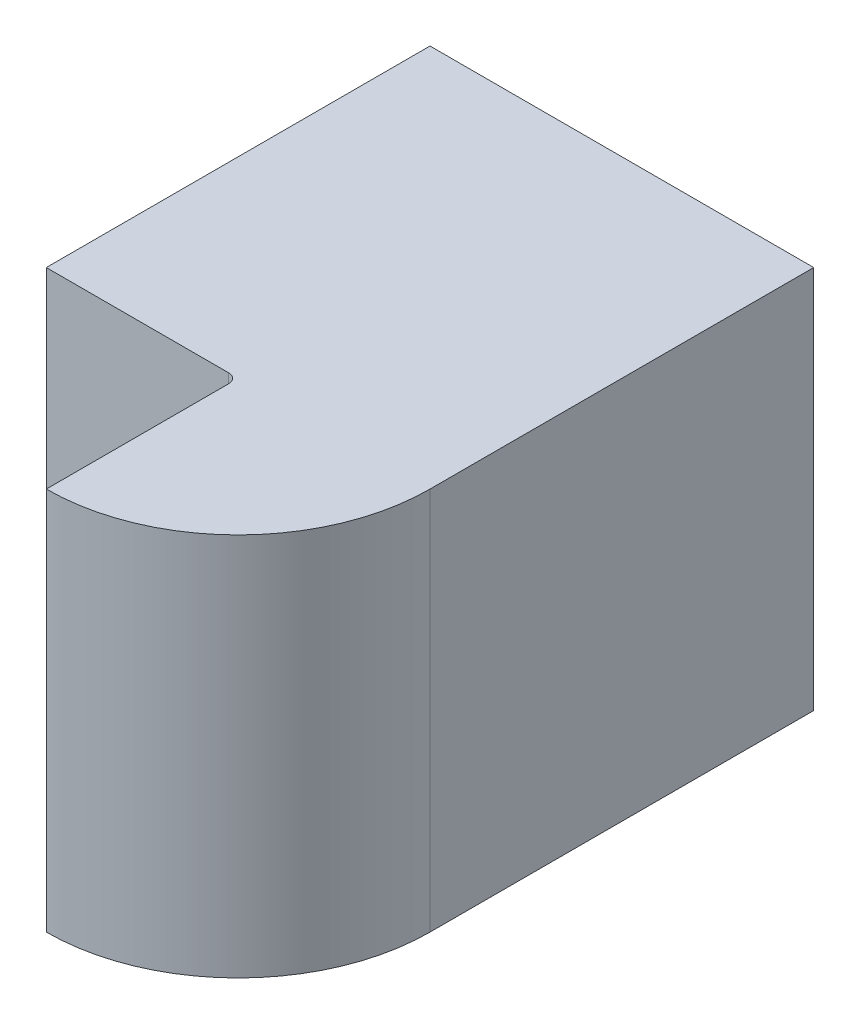
ISO-10303-21;
HEADER;
FILE_DESCRIPTION(('STEP AP214'),'2;1');
FILE_NAME('part.step','',(''),(''),'','','');
FILE_SCHEMA(('AUTOMOTIVE_DESIGN { 1 0 10303 214 1 1 1 1 }'));
ENDSEC;
DATA;
#1=APPLICATION_CONTEXT('core data for automotive mechanical design processes');
#2=APPLICATION_PROTOCOL_DEFINITION('international standard','automotive_design',2000,#1);
#3=PRODUCT_CONTEXT('',#1,'mechanical');
#4=PRODUCT('Part','Part','',(#3));
#5=PRODUCT_RELATED_PRODUCT_CATEGORY('part','',(#4));
#6=PRODUCT_DEFINITION_FORMATION('','',#4);
#7=PRODUCT_DEFINITION_CONTEXT('part definition',#1,'design');
#8=PRODUCT_DEFINITION('design','',#6,#7);
#9=PRODUCT_DEFINITION_SHAPE('','',#8);
#10=(LENGTH_UNIT() NAMED_UNIT(*) SI_UNIT(.MILLI.,.METRE.));
#11=(NAMED_UNIT(*) PLANE_ANGLE_UNIT() SI_UNIT($,.RADIAN.));
#12=(NAMED_UNIT(*) SI_UNIT($,.STERADIAN.) SOLID_ANGLE_UNIT());
#13=UNCERTAINTY_MEASURE_WITH_UNIT(LENGTH_MEASURE(1.E-05),#10,'distance_accuracy_value','');
#14=(GEOMETRIC_REPRESENTATION_CONTEXT(3) GLOBAL_UNCERTAINTY_ASSIGNED_CONTEXT((#13)) GLOBAL_UNIT_ASSIGNED_CONTEXT((#10,
#11,#12)) REPRESENTATION_CONTEXT('',''));
#15=CARTESIAN_POINT('',(0.,0.,0.));
#16=DIRECTION('',(0.,0.,1.));
#17=DIRECTION('',(1.,0.,0.));
#18=AXIS2_PLACEMENT_3D('',#15,#16,#17);
#19=CARTESIAN_POINT('',(-50.8,101.6,50.8));
#20=DIRECTION('',(0.,0.,-1.));
#21=DIRECTION('',(-1.,0.,0.));
#22=AXIS2_PLACEMENT_3D('',#19,#20,#21);
#23=PLANE('',#22);
#24=DIRECTION('',(1.,0.,0.));
#25=VECTOR('',#24,1.);
#26=CARTESIAN_POINT('',(-50.8,0.,50.8));
#27=LINE('',#26,#25);
#28=CARTESIAN_POINT('',(-50.8,0.,50.8));
#29=VERTEX_POINT('',#28);
#30=CARTESIAN_POINT('',(-2.54000000000002,0.,50.8));
#31=VERTEX_POINT('',#30);
#32=EDGE_CURVE('E145',#29,#31,#27,.T.);
#33=ORIENTED_EDGE('',*,*,#32,.T.);
#34=DIRECTION('',(0.,-1.,0.));
#35=VECTOR('',#34,1.);
#36=CARTESIAN_POINT('',(-2.54000000000001,101.6,50.8));
#37=LINE('',#36,#35);
#38=CARTESIAN_POINT('',(-2.54000000000002,101.6,50.8));
#39=VERTEX_POINT('',#38);
#40=EDGE_CURVE('E67',#31,#39,#37,.F.);
#41=ORIENTED_EDGE('',*,*,#40,.T.);
#42=DIRECTION('',(1.,0.,0.));
#43=VECTOR('',#42,1.);
#44=CARTESIAN_POINT('',(-50.8,101.6,50.8));
#45=LINE('',#44,#43);
#46=CARTESIAN_POINT('',(-50.8,101.6,50.8));
#47=VERTEX_POINT('',#46);
#48=EDGE_CURVE('E152',#47,#39,#45,.T.);
#49=ORIENTED_EDGE('',*,*,#48,.F.);
#50=DIRECTION('',(0.,-1.,0.));
#51=VECTOR('',#50,1.);
#52=CARTESIAN_POINT('',(-50.8,101.6,50.8));
#53=LINE('',#52,#51);
#54=EDGE_CURVE('E165',#47,#29,#53,.T.);
#55=ORIENTED_EDGE('',*,*,#54,.T.);
#56=EDGE_LOOP('',(#33,#41,#49,#55));
#57=FACE_BOUND('',#56,.T.);
#58=ADVANCED_FACE('F45',(#57),#23,.F.);
#59=CARTESIAN_POINT('',(-50.8,101.6,50.8));
#60=DIRECTION('',(-1.,0.,0.));
#61=DIRECTION('',(0.,0.,1.));
#62=AXIS2_PLACEMENT_3D('',#59,#60,#61);
#63=PLANE('',#62);
#64=DIRECTION('',(0.,0.,-1.));
#65=VECTOR('',#64,1.);
#66=CARTESIAN_POINT('',(-50.8,0.,50.8));
#67=LINE('',#66,#65);
#68=CARTESIAN_POINT('',(-50.8,0.,-50.8));
#69=VERTEX_POINT('',#68);
#70=EDGE_CURVE('E139',#29,#69,#67,.T.);
#71=ORIENTED_EDGE('',*,*,#70,.F.);
#72=ORIENTED_EDGE('',*,*,#54,.F.);
#73=DIRECTION('',(0.,0.,-1.));
#74=VECTOR('',#73,1.);
#75=CARTESIAN_POINT('',(-50.8,101.6,50.8));
#76=LINE('',#75,#74);
#77=CARTESIAN_POINT('',(-50.8,101.6,-50.8));
#78=VERTEX_POINT('',#77);
#79=EDGE_CURVE('E140',#47,#78,#76,.T.);
#80=ORIENTED_EDGE('',*,*,#79,.T.);
#81=DIRECTION('',(0.,-1.,0.));
#82=VECTOR('',#81,1.);
#83=CARTESIAN_POINT('',(-50.8,101.6,-50.8));
#84=LINE('',#83,#82);
#85=EDGE_CURVE('E155',#78,#69,#84,.T.);
#86=ORIENTED_EDGE('',*,*,#85,.T.);
#87=EDGE_LOOP('',(#71,#72,#80,#86));
#88=FACE_BOUND('',#87,.T.);
#89=ADVANCED_FACE('F183',(#88),#63,.T.);
#90=CARTESIAN_POINT('',(50.8,101.6,50.8));
#91=DIRECTION('',(-1.,0.,0.));
#92=DIRECTION('',(0.,0.,1.));
#93=AXIS2_PLACEMENT_3D('',#90,#91,#92);
#94=PLANE('',#93);
#95=DIRECTION('',(0.,0.,-1.));
#96=VECTOR('',#95,1.);
#97=CARTESIAN_POINT('',(50.8,0.,50.8));
#98=LINE('',#97,#96);
#99=CARTESIAN_POINT('',(50.8,0.,50.8));
#100=VERTEX_POINT('',#99);
#101=CARTESIAN_POINT('',(50.8,0.,-50.8));
#102=VERTEX_POINT('',#101);
#103=EDGE_CURVE('E123',#100,#102,#98,.T.);
#104=ORIENTED_EDGE('',*,*,#103,.T.);
#105=DIRECTION('',(0.,-1.,0.));
#106=VECTOR('',#105,1.);
#107=CARTESIAN_POINT('',(50.8,101.6,-50.8));
#108=LINE('',#107,#106);
#109=CARTESIAN_POINT('',(50.8,101.6,-50.8));
#110=VERTEX_POINT('',#109);
#111=EDGE_CURVE('E171',#110,#102,#108,.T.);
#112=ORIENTED_EDGE('',*,*,#111,.F.);
#113=DIRECTION('',(0.,0.,-1.));
#114=VECTOR('',#113,1.);
#115=CARTESIAN_POINT('',(50.8,101.6,50.8));
#116=LINE('',#115,#114);
#117=CARTESIAN_POINT('',(50.8,101.6,50.8));
#118=VERTEX_POINT('',#117);
#119=EDGE_CURVE('E149',#118,#110,#116,.T.);
#120=ORIENTED_EDGE('',*,*,#119,.F.);
#121=DIRECTION('',(0.,-1.,0.));
#122=VECTOR('',#121,1.);
#123=CARTESIAN_POINT('',(50.8,101.6,50.8));
#124=LINE('',#123,#122);
#125=EDGE_CURVE('E168',#118,#100,#124,.T.);
#126=ORIENTED_EDGE('',*,*,#125,.T.);
#127=EDGE_LOOP('',(#104,#112,#120,#126));
#128=FACE_BOUND('',#127,.T.);
#129=ADVANCED_FACE('F194',(#128),#94,.F.);
#130=CARTESIAN_POINT('',(-50.8,101.6,-50.8));
#131=DIRECTION('',(0.,0.,-1.));
#132=DIRECTION('',(-1.,0.,0.));
#133=AXIS2_PLACEMENT_3D('',#130,#131,#132);
#134=PLANE('',#133);
#135=DIRECTION('',(1.,0.,0.));
#136=VECTOR('',#135,1.);
#137=CARTESIAN_POINT('',(-50.8,0.,-50.8));
#138=LINE('',#137,#136);
#139=EDGE_CURVE('E158',#69,#102,#138,.T.);
#140=ORIENTED_EDGE('',*,*,#139,.F.);
#141=ORIENTED_EDGE('',*,*,#85,.F.);
#142=DIRECTION('',(1.,0.,0.));
#143=VECTOR('',#142,1.);
#144=CARTESIAN_POINT('',(-50.8,101.6,-50.8));
#145=LINE('',#144,#143);
#146=EDGE_CURVE('E144',#78,#110,#145,.T.);
#147=ORIENTED_EDGE('',*,*,#146,.T.);
#148=ORIENTED_EDGE('',*,*,#111,.T.);
#149=EDGE_LOOP('',(#140,#141,#147,#148));
#150=FACE_BOUND('',#149,.T.);
#151=ADVANCED_FACE('F187',(#150),#134,.T.);
#152=CARTESIAN_POINT('',(0.,101.6,0.));
#153=DIRECTION('',(0.,-1.,0.));
#154=DIRECTION('',(0.,0.,-1.));
#155=AXIS2_PLACEMENT_3D('',#152,#153,#154);
#156=PLANE('',#155);
#157=ORIENTED_EDGE('',*,*,#79,.F.);
#158=ORIENTED_EDGE('',*,*,#48,.T.);
#159=CARTESIAN_POINT('',(-2.54000000000001,101.6,53.34));
#160=DIRECTION('',(0.,-1.,0.));
#161=DIRECTION('',(0.,0.,-1.));
#162=AXIS2_PLACEMENT_3D('',#159,#160,#161);
#163=CIRCLE('',#162,2.54);
#164=CARTESIAN_POINT('',(0.,101.6,53.34));
#165=VERTEX_POINT('',#164);
#166=EDGE_CURVE('E11',#39,#165,#163,.T.);
#167=ORIENTED_EDGE('',*,*,#166,.T.);
#168=DIRECTION('',(0.,0.,-1.));
#169=VECTOR('',#168,1.);
#170=CARTESIAN_POINT('',(0.,101.6,50.8));
#171=LINE('',#170,#169);
#172=CARTESIAN_POINT('',(-1.80411241501588E-13,101.6,101.6));
#173=VERTEX_POINT('',#172);
#174=EDGE_CURVE('E128',#173,#165,#171,.T.);
#175=ORIENTED_EDGE('',*,*,#174,.F.);
#176=CARTESIAN_POINT('',(0.,101.6,50.8));
#177=DIRECTION('',(0.,1.,0.));
#178=DIRECTION('',(0.,0.,1.));
#179=AXIS2_PLACEMENT_3D('',#176,#177,#178);
#180=CIRCLE('',#179,50.8);
#181=EDGE_CURVE('E127',#173,#118,#180,.T.);
#182=ORIENTED_EDGE('',*,*,#181,.T.);
#183=ORIENTED_EDGE('',*,*,#119,.T.);
#184=ORIENTED_EDGE('',*,*,#146,.F.);
#185=EDGE_LOOP('',(#157,#158,#167,#175,#182,#183,#184));
#186=FACE_BOUND('',#185,.T.);
#187=ADVANCED_FACE('F192',(#186),#156,.F.);
#188=CARTESIAN_POINT('',(0.,0.,0.));
#189=DIRECTION('',(0.,-1.,0.));
#190=DIRECTION('',(0.,0.,-1.));
#191=AXIS2_PLACEMENT_3D('',#188,#189,#190);
#192=PLANE('',#191);
#193=ORIENTED_EDGE('',*,*,#70,.T.);
#194=ORIENTED_EDGE('',*,*,#139,.T.);
#195=ORIENTED_EDGE('',*,*,#103,.F.);
#196=CARTESIAN_POINT('',(0.,0.,50.8));
#197=DIRECTION('',(0.,1.,0.));
#198=DIRECTION('',(0.,0.,1.));
#199=AXIS2_PLACEMENT_3D('',#196,#197,#198);
#200=CIRCLE('',#199,50.8);
#201=CARTESIAN_POINT('',(-1.80411241501588E-13,0.,101.6));
#202=VERTEX_POINT('',#201);
#203=EDGE_CURVE('E118',#202,#100,#200,.T.);
#204=ORIENTED_EDGE('',*,*,#203,.F.);
#205=DIRECTION('',(0.,0.,1.));
#206=VECTOR('',#205,1.);
#207=CARTESIAN_POINT('',(-1.80411241501588E-13,0.,101.6));
#208=LINE('',#207,#206);
#209=CARTESIAN_POINT('',(0.,0.,53.34));
#210=VERTEX_POINT('',#209);
#211=EDGE_CURVE('E105',#210,#202,#208,.T.);
#212=ORIENTED_EDGE('',*,*,#211,.F.);
#213=CARTESIAN_POINT('',(-2.54000000000001,0.,53.34));
#214=DIRECTION('',(0.,-1.,0.));
#215=DIRECTION('',(0.,0.,-1.));
#216=AXIS2_PLACEMENT_3D('',#213,#214,#215);
#217=CIRCLE('',#216,2.54);
#218=EDGE_CURVE('E54',#210,#31,#217,.F.);
#219=ORIENTED_EDGE('',*,*,#218,.T.);
#220=ORIENTED_EDGE('',*,*,#32,.F.);
#221=EDGE_LOOP('',(#193,#194,#195,#204,#212,#219,#220));
#222=FACE_BOUND('',#221,.T.);
#223=ADVANCED_FACE('F120',(#222),#192,.T.);
#224=CARTESIAN_POINT('',(0.,0.,50.8));
#225=DIRECTION('',(0.,1.,0.));
#226=DIRECTION('',(0.,0.,1.));
#227=AXIS2_PLACEMENT_3D('',#224,#225,#226);
#228=CYLINDRICAL_SURFACE('',#227,50.8);
#229=DIRECTION('',(0.,1.,0.));
#230=VECTOR('',#229,1.);
#231=CARTESIAN_POINT('',(-1.80411241501588E-13,101.6,101.6));
#232=LINE('',#231,#230);
#233=EDGE_CURVE('E110',#202,#173,#232,.T.);
#234=ORIENTED_EDGE('',*,*,#233,.F.);
#235=ORIENTED_EDGE('',*,*,#203,.T.);
#236=ORIENTED_EDGE('',*,*,#125,.F.);
#237=ORIENTED_EDGE('',*,*,#181,.F.);
#238=EDGE_LOOP('',(#234,#235,#236,#237));
#239=FACE_BOUND('',#238,.T.);
#240=ADVANCED_FACE('F130',(#239),#228,.T.);
#241=CARTESIAN_POINT('',(0.,0.,50.8));
#242=DIRECTION('',(1.,0.,0.));
#243=DIRECTION('',(0.,0.,-1.));
#244=AXIS2_PLACEMENT_3D('',#241,#242,#243);
#245=PLANE('',#244);
#246=ORIENTED_EDGE('',*,*,#174,.T.);
#247=DIRECTION('',(0.,-1.,0.));
#248=VECTOR('',#247,1.);
#249=CARTESIAN_POINT('',(0.,0.,53.34));
#250=LINE('',#249,#248);
#251=EDGE_CURVE('E113',#165,#210,#250,.T.);
#252=ORIENTED_EDGE('',*,*,#251,.T.);
#253=ORIENTED_EDGE('',*,*,#211,.T.);
#254=ORIENTED_EDGE('',*,*,#233,.T.);
#255=EDGE_LOOP('',(#246,#252,#253,#254));
#256=FACE_BOUND('',#255,.T.);
#257=ADVANCED_FACE('F108',(#256),#245,.F.);
#258=CARTESIAN_POINT('',(-2.54000000000001,0.,53.34));
#259=DIRECTION('',(0.,1.,0.));
#260=DIRECTION('',(0.,0.,1.));
#261=AXIS2_PLACEMENT_3D('',#258,#259,#260);
#262=CYLINDRICAL_SURFACE('',#261,2.54);
#263=ORIENTED_EDGE('',*,*,#166,.F.);
#264=ORIENTED_EDGE('',*,*,#40,.F.);
#265=ORIENTED_EDGE('',*,*,#218,.F.);
#266=ORIENTED_EDGE('',*,*,#251,.F.);
#267=EDGE_LOOP('',(#263,#264,#265,#266));
#268=FACE_BOUND('',#267,.T.);
#269=ADVANCED_FACE('F47',(#268),#262,.F.);
#270=CLOSED_SHELL('',(#58,#89,#129,#151,#187,#223,#240,#257,#269));
#271=MANIFOLD_SOLID_BREP('B2',#270);
#272=ADVANCED_BREP_SHAPE_REPRESENTATION('',(#18,#271),#14);
#273=SHAPE_DEFINITION_REPRESENTATION(#9,#272);
ENDSEC;
END-ISO-10303-21;
